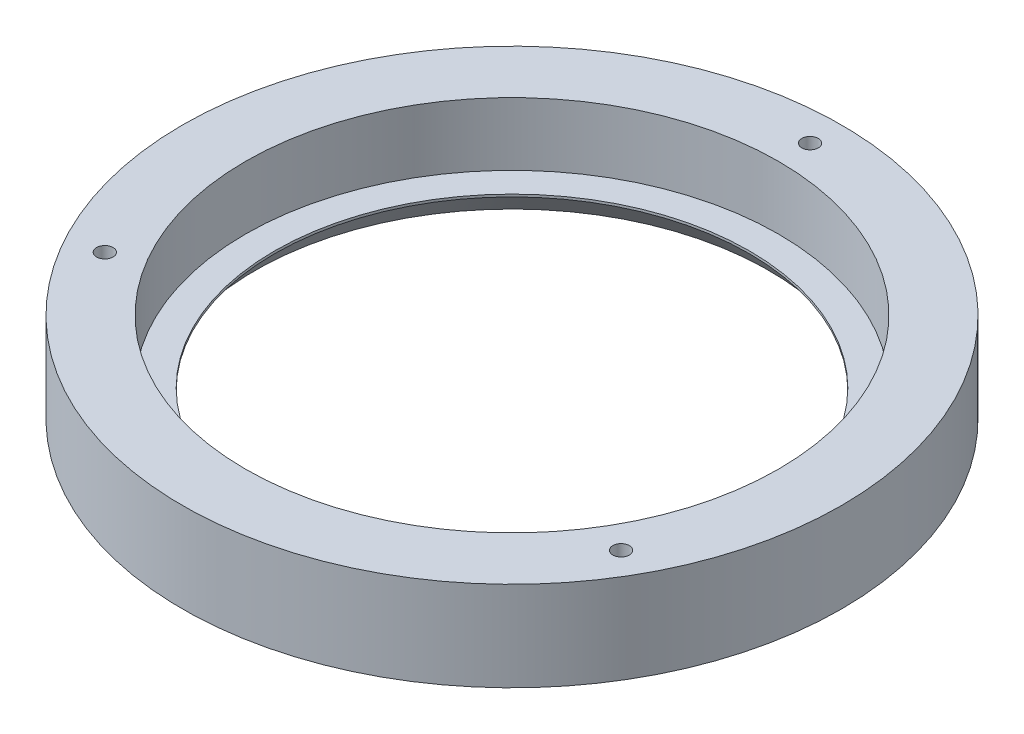
ISO-10303-21;
HEADER;
FILE_DESCRIPTION(('STEP AP214'),'2;1');
FILE_NAME('part.step','',(''),(''),'','','');
FILE_SCHEMA(('AUTOMOTIVE_DESIGN { 1 0 10303 214 1 1 1 1 }'));
ENDSEC;
DATA;
#1=APPLICATION_CONTEXT('core data for automotive mechanical design processes');
#2=APPLICATION_PROTOCOL_DEFINITION('international standard','automotive_design',2000,#1);
#3=PRODUCT_CONTEXT('',#1,'mechanical');
#4=PRODUCT('Part','Part','',(#3));
#5=PRODUCT_RELATED_PRODUCT_CATEGORY('part','',(#4));
#6=PRODUCT_DEFINITION_FORMATION('','',#4);
#7=PRODUCT_DEFINITION_CONTEXT('part definition',#1,'design');
#8=PRODUCT_DEFINITION('design','',#6,#7);
#9=PRODUCT_DEFINITION_SHAPE('','',#8);
#10=(LENGTH_UNIT() NAMED_UNIT(*) SI_UNIT(.MILLI.,.METRE.));
#11=(NAMED_UNIT(*) PLANE_ANGLE_UNIT() SI_UNIT($,.RADIAN.));
#12=(NAMED_UNIT(*) SI_UNIT($,.STERADIAN.) SOLID_ANGLE_UNIT());
#13=UNCERTAINTY_MEASURE_WITH_UNIT(LENGTH_MEASURE(1.E-05),#10,'distance_accuracy_value','');
#14=(GEOMETRIC_REPRESENTATION_CONTEXT(3) GLOBAL_UNCERTAINTY_ASSIGNED_CONTEXT((#13)) GLOBAL_UNIT_ASSIGNED_CONTEXT((#10,
#11,#12)) REPRESENTATION_CONTEXT('',''));
#15=CARTESIAN_POINT('',(0.,0.,0.));
#16=DIRECTION('',(0.,0.,1.));
#17=DIRECTION('',(1.,0.,0.));
#18=AXIS2_PLACEMENT_3D('',#15,#16,#17);
#19=CARTESIAN_POINT('',(1.66533453693773E-13,-2.77555756156289E-13,-61.4999999999997));
#20=DIRECTION('',(0.,1.,0.));
#21=DIRECTION('',(-1.,0.,0.));
#22=AXIS2_PLACEMENT_3D('',#19,#20,#21);
#23=CYLINDRICAL_SURFACE('',#22,1.70000000000001);
#24=CARTESIAN_POINT('',(0.,18.4999999999999,-61.4999999999998));
#25=DIRECTION('',(0.,1.,0.));
#26=DIRECTION('',(-1.,0.,0.));
#27=AXIS2_PLACEMENT_3D('',#24,#25,#26);
#28=CIRCLE('',#27,1.70000000000001);
#29=CARTESIAN_POINT('',(-1.70000000000006,18.4999999999999,-61.4999999999998));
#30=VERTEX_POINT('',#29);
#31=EDGE_CURVE('E384',#30,#30,#28,.T.);
#32=ORIENTED_EDGE('',*,*,#31,.T.);
#33=EDGE_LOOP('',(#32));
#34=FACE_BOUND('',#33,.T.);
#35=CARTESIAN_POINT('',(0.,2.99999999999973,-61.5));
#36=DIRECTION('',(0.,-1.,0.));
#37=DIRECTION('',(1.,0.,0.));
#38=AXIS2_PLACEMENT_3D('',#35,#36,#37);
#39=CIRCLE('',#38,1.70000000000001);
#40=CARTESIAN_POINT('',(1.70000000000001,2.99999999999973,-61.5));
#41=VERTEX_POINT('',#40);
#42=EDGE_CURVE('E50',#41,#41,#39,.F.);
#43=ORIENTED_EDGE('',*,*,#42,.F.);
#44=EDGE_LOOP('',(#43));
#45=FACE_BOUND('',#44,.T.);
#46=ADVANCED_FACE('F46',(#34,#45),#23,.F.);
#47=CARTESIAN_POINT('',(53.2605623327429,-2.77555756156289E-13,30.7500000000004));
#48=DIRECTION('',(0.,1.,0.));
#49=DIRECTION('',(-1.,0.,0.));
#50=AXIS2_PLACEMENT_3D('',#47,#48,#49);
#51=CYLINDRICAL_SURFACE('',#50,1.70000000000001);
#52=CARTESIAN_POINT('',(53.260562332743,18.4999999999995,30.7500000000008));
#53=DIRECTION('',(0.,1.,0.));
#54=DIRECTION('',(0.500000000000005,0.,-0.866025403784438));
#55=AXIS2_PLACEMENT_3D('',#52,#53,#54);
#56=CIRCLE('',#55,1.70000000000001);
#57=CARTESIAN_POINT('',(54.110562332743,18.4999999999995,29.2777568135672));
#58=VERTEX_POINT('',#57);
#59=EDGE_CURVE('E380',#58,#58,#56,.T.);
#60=ORIENTED_EDGE('',*,*,#59,.T.);
#61=EDGE_LOOP('',(#60));
#62=FACE_BOUND('',#61,.T.);
#63=CARTESIAN_POINT('',(53.2605623327429,2.99999999999973,30.7500000000004));
#64=DIRECTION('',(0.,-1.,0.));
#65=DIRECTION('',(1.,0.,0.));
#66=AXIS2_PLACEMENT_3D('',#63,#64,#65);
#67=CIRCLE('',#66,1.70000000000001);
#68=CARTESIAN_POINT('',(54.9605623327429,2.99999999999973,30.7500000000004));
#69=VERTEX_POINT('',#68);
#70=EDGE_CURVE('E238',#69,#69,#67,.F.);
#71=ORIENTED_EDGE('',*,*,#70,.F.);
#72=EDGE_LOOP('',(#71));
#73=FACE_BOUND('',#72,.T.);
#74=ADVANCED_FACE('F428',(#62,#73),#51,.F.);
#75=CARTESIAN_POINT('',(-53.2605623327435,-3.33066907387547E-13,30.7499999999996));
#76=DIRECTION('',(0.,1.,0.));
#77=DIRECTION('',(-1.,0.,0.));
#78=AXIS2_PLACEMENT_3D('',#75,#76,#77);
#79=CYLINDRICAL_SURFACE('',#78,1.70000000000001);
#80=CARTESIAN_POINT('',(-53.2605623327433,18.4999999999997,30.7499999999997));
#81=DIRECTION('',(0.,1.,0.));
#82=DIRECTION('',(0.499999999999993,0.,0.866025403784445));
#83=AXIS2_PLACEMENT_3D('',#80,#81,#82);
#84=CIRCLE('',#83,1.70000000000001);
#85=CARTESIAN_POINT('',(-52.4105623327433,18.4999999999997,32.2222431864333));
#86=VERTEX_POINT('',#85);
#87=EDGE_CURVE('E385',#86,#86,#84,.T.);
#88=ORIENTED_EDGE('',*,*,#87,.T.);
#89=EDGE_LOOP('',(#88));
#90=FACE_BOUND('',#89,.T.);
#91=CARTESIAN_POINT('',(-53.2605623327436,3.,30.7499999999996));
#92=DIRECTION('',(0.,-1.,0.));
#93=DIRECTION('',(1.,0.,0.));
#94=AXIS2_PLACEMENT_3D('',#91,#92,#93);
#95=CIRCLE('',#94,1.70000000000001);
#96=CARTESIAN_POINT('',(-51.5605623327436,3.,30.7499999999996));
#97=VERTEX_POINT('',#96);
#98=EDGE_CURVE('E364',#97,#97,#95,.F.);
#99=ORIENTED_EDGE('',*,*,#98,.F.);
#100=EDGE_LOOP('',(#99));
#101=FACE_BOUND('',#100,.T.);
#102=ADVANCED_FACE('F434',(#90,#101),#79,.F.);
#103=CARTESIAN_POINT('',(0.,4.99999999999995,2.77555756156289E-13));
#104=DIRECTION('',(0.,-1.,0.));
#105=DIRECTION('',(1.,0.,0.));
#106=AXIS2_PLACEMENT_3D('',#103,#104,#105);
#107=CONICAL_SURFACE('',#106,49.,0.674740942223553);
#108=CARTESIAN_POINT('',(0.,0.,0.));
#109=DIRECTION('',(0.,-1.,0.));
#110=DIRECTION('',(1.,0.,0.));
#111=AXIS2_PLACEMENT_3D('',#108,#109,#110);
#112=CIRCLE('',#111,53.);
#113=CARTESIAN_POINT('',(53.0000000000001,0.,0.));
#114=VERTEX_POINT('',#113);
#115=EDGE_CURVE('E11',#114,#114,#112,.T.);
#116=ORIENTED_EDGE('',*,*,#115,.T.);
#117=EDGE_LOOP('',(#116));
#118=FACE_BOUND('',#117,.T.);
#119=CARTESIAN_POINT('',(0.,4.99999999999995,2.77555756156289E-13));
#120=DIRECTION('',(0.,-1.,0.));
#121=DIRECTION('',(1.,0.,0.));
#122=AXIS2_PLACEMENT_3D('',#119,#120,#121);
#123=CIRCLE('',#122,49.);
#124=CARTESIAN_POINT('',(49.0000000000001,4.99999999999996,2.90428366921572E-13));
#125=VERTEX_POINT('',#124);
#126=EDGE_CURVE('E392',#125,#125,#123,.T.);
#127=ORIENTED_EDGE('',*,*,#126,.F.);
#128=EDGE_LOOP('',(#127));
#129=FACE_BOUND('',#128,.T.);
#130=ADVANCED_FACE('F48',(#118,#129),#107,.F.);
#131=CARTESIAN_POINT('',(53.,-2.63677968348475E-13,3.88578058618805E-13));
#132=DIRECTION('',(0.,-1.,0.));
#133=DIRECTION('',(1.,0.,0.));
#134=AXIS2_PLACEMENT_3D('',#131,#132,#133);
#135=PLANE('',#134);
#136=DIRECTION('',(0.499999999999994,0.,0.866025403784444));
#137=VECTOR('',#136,1.);
#138=CARTESIAN_POINT('',(1.67500000000087,-2.63677968348475E-13,-64.4011851026779));
#139=LINE('',#138,#137);
#140=CARTESIAN_POINT('',(1.67500000000087,-2.63677968348475E-13,-64.4011851026779));
#141=VERTEX_POINT('',#140);
#142=CARTESIAN_POINT('',(3.35000000000107,0.,-61.4999999999999));
#143=VERTEX_POINT('',#142);
#144=EDGE_CURVE('E64',#141,#143,#139,.T.);
#145=ORIENTED_EDGE('',*,*,#144,.F.);
#146=DIRECTION('',(1.,0.,0.));
#147=VECTOR('',#146,1.);
#148=CARTESIAN_POINT('',(-1.67499999999915,0.,-64.4011851026778));
#149=LINE('',#148,#147);
#150=CARTESIAN_POINT('',(-1.67499999999915,0.,-64.4011851026778));
#151=VERTEX_POINT('',#150);
#152=EDGE_CURVE('E199',#151,#141,#149,.T.);
#153=ORIENTED_EDGE('',*,*,#152,.F.);
#154=DIRECTION('',(0.500000000000007,0.,-0.866025403784437));
#155=VECTOR('',#154,1.);
#156=CARTESIAN_POINT('',(-3.34999999999896,-2.77555756156289E-13,-61.5000000000001));
#157=LINE('',#156,#155);
#158=CARTESIAN_POINT('',(-3.34999999999896,-2.77555756156289E-13,-61.5000000000001));
#159=VERTEX_POINT('',#158);
#160=EDGE_CURVE('E204',#159,#151,#157,.T.);
#161=ORIENTED_EDGE('',*,*,#160,.F.);
#162=DIRECTION('',(-0.499999999999995,0.,-0.866025403784444));
#163=VECTOR('',#162,1.);
#164=CARTESIAN_POINT('',(-1.67499999999915,-2.77555756156289E-13,-58.5988148973225));
#165=LINE('',#164,#163);
#166=CARTESIAN_POINT('',(-1.67499999999915,-2.77555756156289E-13,-58.5988148973225));
#167=VERTEX_POINT('',#166);
#168=EDGE_CURVE('E228',#167,#159,#165,.T.);
#169=ORIENTED_EDGE('',*,*,#168,.F.);
#170=DIRECTION('',(-1.,0.,0.));
#171=VECTOR('',#170,1.);
#172=CARTESIAN_POINT('',(1.67500000000087,-2.77555756156289E-13,-58.5988148973221));
#173=LINE('',#172,#171);
#174=CARTESIAN_POINT('',(1.67500000000087,-2.77555756156289E-13,-58.5988148973221));
#175=VERTEX_POINT('',#174);
#176=EDGE_CURVE('E224',#175,#167,#173,.T.);
#177=ORIENTED_EDGE('',*,*,#176,.F.);
#178=DIRECTION('',(-0.500000000000009,0.,0.866025403784436));
#179=VECTOR('',#178,1.);
#180=CARTESIAN_POINT('',(3.35000000000107,0.,-61.4999999999999));
#181=LINE('',#180,#179);
#182=EDGE_CURVE('E220',#143,#175,#181,.T.);
#183=ORIENTED_EDGE('',*,*,#182,.F.);
#184=EDGE_LOOP('',(#145,#153,#161,#169,#177,#183));
#185=FACE_BOUND('',#184,.T.);
#186=DIRECTION('',(-1.,0.,0.));
#187=VECTOR('',#186,1.);
#188=CARTESIAN_POINT('',(54.9355623327425,-2.22044604925031E-13,33.6511851026789));
#189=LINE('',#188,#187);
#190=CARTESIAN_POINT('',(54.9355623327425,-2.22044604925031E-13,33.6511851026789));
#191=VERTEX_POINT('',#190);
#192=CARTESIAN_POINT('',(51.5855623327428,-2.08166817117217E-13,33.6511851026792));
#193=VERTEX_POINT('',#192);
#194=EDGE_CURVE('E72',#191,#193,#189,.T.);
#195=ORIENTED_EDGE('',*,*,#194,.F.);
#196=DIRECTION('',(-0.500000000000012,0.,0.866025403784434));
#197=VECTOR('',#196,1.);
#198=CARTESIAN_POINT('',(56.6105623327425,0.,30.7500000000013));
#199=LINE('',#198,#197);
#200=CARTESIAN_POINT('',(56.6105623327425,0.,30.7500000000013));
#201=VERTEX_POINT('',#200);
#202=EDGE_CURVE('E255',#201,#191,#199,.T.);
#203=ORIENTED_EDGE('',*,*,#202,.F.);
#204=DIRECTION('',(0.499999999999991,0.,0.866025403784446));
#205=VECTOR('',#204,1.);
#206=CARTESIAN_POINT('',(54.9355623327423,-2.63677968348475E-13,27.8488148973233));
#207=LINE('',#206,#205);
#208=CARTESIAN_POINT('',(54.9355623327423,-2.63677968348475E-13,27.8488148973233));
#209=VERTEX_POINT('',#208);
#210=EDGE_CURVE('E290',#209,#201,#207,.T.);
#211=ORIENTED_EDGE('',*,*,#210,.F.);
#212=DIRECTION('',(1.,0.,0.));
#213=VECTOR('',#212,1.);
#214=CARTESIAN_POINT('',(51.5855623327427,0.,27.8488148973233));
#215=LINE('',#214,#213);
#216=CARTESIAN_POINT('',(51.5855623327427,0.,27.8488148973233));
#217=VERTEX_POINT('',#216);
#218=EDGE_CURVE('E286',#217,#209,#215,.T.);
#219=ORIENTED_EDGE('',*,*,#218,.F.);
#220=DIRECTION('',(0.500000000000014,0.,-0.866025403784432));
#221=VECTOR('',#220,1.);
#222=CARTESIAN_POINT('',(49.9105623327424,-2.77555756156289E-13,30.7500000000009));
#223=LINE('',#222,#221);
#224=CARTESIAN_POINT('',(49.9105623327424,-2.77555756156289E-13,30.7500000000009));
#225=VERTEX_POINT('',#224);
#226=EDGE_CURVE('E282',#225,#217,#223,.T.);
#227=ORIENTED_EDGE('',*,*,#226,.F.);
#228=DIRECTION('',(-0.499999999999989,0.,-0.866025403784447));
#229=VECTOR('',#228,1.);
#230=CARTESIAN_POINT('',(51.5855623327428,-2.08166817117217E-13,33.6511851026792));
#231=LINE('',#230,#229);
#232=EDGE_CURVE('E278',#193,#225,#231,.T.);
#233=ORIENTED_EDGE('',*,*,#232,.F.);
#234=EDGE_LOOP('',(#195,#203,#211,#219,#227,#233));
#235=FACE_BOUND('',#234,.T.);
#236=DIRECTION('',(0.500000000000004,0.,-0.866025403784438));
#237=VECTOR('',#236,1.);
#238=CARTESIAN_POINT('',(-56.6105623327437,0.,30.7499999999998));
#239=LINE('',#238,#237);
#240=CARTESIAN_POINT('',(-56.6105623327437,0.,30.7499999999998));
#241=VERTEX_POINT('',#240);
#242=CARTESIAN_POINT('',(-54.9355623327432,-2.77555756156289E-13,27.8488148973219));
#243=VERTEX_POINT('',#242);
#244=EDGE_CURVE('E339',#241,#243,#239,.T.);
#245=ORIENTED_EDGE('',*,*,#244,.F.);
#246=DIRECTION('',(-0.499999999999998,0.,-0.866025403784442));
#247=VECTOR('',#246,1.);
#248=CARTESIAN_POINT('',(-54.9355623327432,-3.33066907387547E-13,33.6511851026777));
#249=LINE('',#248,#247);
#250=CARTESIAN_POINT('',(-54.9355623327432,-3.33066907387547E-13,33.6511851026777));
#251=VERTEX_POINT('',#250);
#252=EDGE_CURVE('E318',#251,#241,#249,.T.);
#253=ORIENTED_EDGE('',*,*,#252,.F.);
#254=DIRECTION('',(-1.,0.,0.));
#255=VECTOR('',#254,1.);
#256=CARTESIAN_POINT('',(-51.5855623327433,-2.91433543964104E-13,33.6511851026775));
#257=LINE('',#256,#255);
#258=CARTESIAN_POINT('',(-51.5855623327433,-2.91433543964104E-13,33.6511851026775));
#259=VERTEX_POINT('',#258);
#260=EDGE_CURVE('E354',#259,#251,#257,.T.);
#261=ORIENTED_EDGE('',*,*,#260,.F.);
#262=DIRECTION('',(-0.500000000000003,0.,0.866025403784439));
#263=VECTOR('',#262,1.);
#264=CARTESIAN_POINT('',(-49.9105623327434,-2.22044604925031E-13,30.7499999999996));
#265=LINE('',#264,#263);
#266=CARTESIAN_POINT('',(-49.9105623327434,-2.22044604925031E-13,30.7499999999996));
#267=VERTEX_POINT('',#266);
#268=EDGE_CURVE('E350',#267,#259,#265,.T.);
#269=ORIENTED_EDGE('',*,*,#268,.F.);
#270=DIRECTION('',(0.499999999999996,0.,0.866025403784443));
#271=VECTOR('',#270,1.);
#272=CARTESIAN_POINT('',(-51.5855623327433,-2.77555756156289E-13,27.8488148973217));
#273=LINE('',#272,#271);
#274=CARTESIAN_POINT('',(-51.5855623327433,-2.77555756156289E-13,27.8488148973217));
#275=VERTEX_POINT('',#274);
#276=EDGE_CURVE('E346',#275,#267,#273,.T.);
#277=ORIENTED_EDGE('',*,*,#276,.F.);
#278=DIRECTION('',(1.,0.,0.));
#279=VECTOR('',#278,1.);
#280=CARTESIAN_POINT('',(-54.9355623327432,-2.77555756156289E-13,27.8488148973219));
#281=LINE('',#280,#279);
#282=EDGE_CURVE('E342',#243,#275,#281,.T.);
#283=ORIENTED_EDGE('',*,*,#282,.F.);
#284=EDGE_LOOP('',(#245,#253,#261,#269,#277,#283));
#285=FACE_BOUND('',#284,.T.);
#286=CARTESIAN_POINT('',(0.,0.,0.));
#287=DIRECTION('',(0.,-1.,0.));
#288=DIRECTION('',(1.,0.,0.));
#289=AXIS2_PLACEMENT_3D('',#286,#287,#288);
#290=CIRCLE('',#289,68.);
#291=CARTESIAN_POINT('',(68.0000000000002,0.,0.));
#292=VERTEX_POINT('',#291);
#293=EDGE_CURVE('E56',#292,#292,#290,.T.);
#294=ORIENTED_EDGE('',*,*,#293,.T.);
#295=EDGE_LOOP('',(#294));
#296=FACE_BOUND('',#295,.T.);
#297=ORIENTED_EDGE('',*,*,#115,.F.);
#298=EDGE_LOOP('',(#297));
#299=FACE_BOUND('',#298,.T.);
#300=ADVANCED_FACE('F458',(#185,#235,#285,#296,#299),#135,.T.);
#301=CARTESIAN_POINT('',(0.,-18.5000000000003,-1.66533453693773E-13));
#302=DIRECTION('',(0.,-1.,0.));
#303=DIRECTION('',(1.,0.,0.));
#304=AXIS2_PLACEMENT_3D('',#301,#302,#303);
#305=CYLINDRICAL_SURFACE('',#304,68.);
#306=CARTESIAN_POINT('',(0.,18.4999999999997,0.));
#307=DIRECTION('',(0.,-1.,0.));
#308=DIRECTION('',(1.,0.,0.));
#309=AXIS2_PLACEMENT_3D('',#306,#307,#308);
#310=CIRCLE('',#309,68.);
#311=CARTESIAN_POINT('',(68.0000000000001,18.4999999999997,0.));
#312=VERTEX_POINT('',#311);
#313=EDGE_CURVE('E408',#312,#312,#310,.T.);
#314=ORIENTED_EDGE('',*,*,#313,.T.);
#315=EDGE_LOOP('',(#314));
#316=FACE_BOUND('',#315,.T.);
#317=ORIENTED_EDGE('',*,*,#293,.F.);
#318=EDGE_LOOP('',(#317));
#319=FACE_BOUND('',#318,.T.);
#320=ADVANCED_FACE('F455',(#316,#319),#305,.T.);
#321=CARTESIAN_POINT('',(68.0000000000003,18.4999999999997,2.22044604925031E-13));
#322=DIRECTION('',(0.,1.,0.));
#323=DIRECTION('',(-1.,0.,0.));
#324=AXIS2_PLACEMENT_3D('',#321,#322,#323);
#325=PLANE('',#324);
#326=ORIENTED_EDGE('',*,*,#59,.F.);
#327=EDGE_LOOP('',(#326));
#328=FACE_BOUND('',#327,.T.);
#329=ORIENTED_EDGE('',*,*,#87,.F.);
#330=EDGE_LOOP('',(#329));
#331=FACE_BOUND('',#330,.T.);
#332=ORIENTED_EDGE('',*,*,#31,.F.);
#333=EDGE_LOOP('',(#332));
#334=FACE_BOUND('',#333,.T.);
#335=CARTESIAN_POINT('',(0.,18.4999999999997,0.));
#336=DIRECTION('',(0.,-1.,0.));
#337=DIRECTION('',(1.,0.,0.));
#338=AXIS2_PLACEMENT_3D('',#335,#336,#337);
#339=CIRCLE('',#338,55.);
#340=CARTESIAN_POINT('',(55.0000000000001,18.4999999999997,0.));
#341=VERTEX_POINT('',#340);
#342=EDGE_CURVE('E404',#341,#341,#339,.T.);
#343=ORIENTED_EDGE('',*,*,#342,.T.);
#344=EDGE_LOOP('',(#343));
#345=FACE_BOUND('',#344,.T.);
#346=ORIENTED_EDGE('',*,*,#313,.F.);
#347=EDGE_LOOP('',(#346));
#348=FACE_BOUND('',#347,.T.);
#349=ADVANCED_FACE('F451',(#328,#331,#334,#345,#348),#325,.T.);
#350=CARTESIAN_POINT('',(0.,-18.5000000000003,-1.66533453693773E-13));
#351=DIRECTION('',(0.,-1.,0.));
#352=DIRECTION('',(1.,0.,0.));
#353=AXIS2_PLACEMENT_3D('',#350,#351,#352);
#354=CYLINDRICAL_SURFACE('',#353,55.);
#355=CARTESIAN_POINT('',(0.,5.49999999999995,0.));
#356=DIRECTION('',(0.,-1.,0.));
#357=DIRECTION('',(1.,0.,0.));
#358=AXIS2_PLACEMENT_3D('',#355,#356,#357);
#359=CIRCLE('',#358,55.);
#360=CARTESIAN_POINT('',(55.0000000000001,5.49999999999996,0.));
#361=VERTEX_POINT('',#360);
#362=EDGE_CURVE('E400',#361,#361,#359,.T.);
#363=ORIENTED_EDGE('',*,*,#362,.T.);
#364=EDGE_LOOP('',(#363));
#365=FACE_BOUND('',#364,.T.);
#366=ORIENTED_EDGE('',*,*,#342,.F.);
#367=EDGE_LOOP('',(#366));
#368=FACE_BOUND('',#367,.T.);
#369=ADVANCED_FACE('F447',(#365,#368),#354,.F.);
#370=CARTESIAN_POINT('',(55.,5.49999999999972,2.77555756156289E-13));
#371=DIRECTION('',(0.,1.,0.));
#372=DIRECTION('',(-1.,0.,0.));
#373=AXIS2_PLACEMENT_3D('',#370,#371,#372);
#374=PLANE('',#373);
#375=CARTESIAN_POINT('',(0.,5.49999999999995,0.));
#376=DIRECTION('',(0.,-1.,0.));
#377=DIRECTION('',(1.,0.,0.));
#378=AXIS2_PLACEMENT_3D('',#375,#376,#377);
#379=CIRCLE('',#378,49.);
#380=CARTESIAN_POINT('',(49.0000000000001,5.49999999999996,0.));
#381=VERTEX_POINT('',#380);
#382=EDGE_CURVE('E396',#381,#381,#379,.T.);
#383=ORIENTED_EDGE('',*,*,#382,.T.);
#384=EDGE_LOOP('',(#383));
#385=FACE_BOUND('',#384,.T.);
#386=ORIENTED_EDGE('',*,*,#362,.F.);
#387=EDGE_LOOP('',(#386));
#388=FACE_BOUND('',#387,.T.);
#389=ADVANCED_FACE('F443',(#385,#388),#374,.T.);
#390=CARTESIAN_POINT('',(0.,-18.5000000000003,-1.66533453693773E-13));
#391=DIRECTION('',(0.,-1.,0.));
#392=DIRECTION('',(1.,0.,0.));
#393=AXIS2_PLACEMENT_3D('',#390,#391,#392);
#394=CYLINDRICAL_SURFACE('',#393,49.);
#395=ORIENTED_EDGE('',*,*,#126,.T.);
#396=EDGE_LOOP('',(#395));
#397=FACE_BOUND('',#396,.T.);
#398=ORIENTED_EDGE('',*,*,#382,.F.);
#399=EDGE_LOOP('',(#398));
#400=FACE_BOUND('',#399,.T.);
#401=ADVANCED_FACE('F439',(#397,#400),#394,.F.);
#402=CARTESIAN_POINT('',(0.,2.99999999999995,2.77555756156289E-13));
#403=DIRECTION('',(0.,-1.,0.));
#404=DIRECTION('',(1.,0.,0.));
#405=AXIS2_PLACEMENT_3D('',#402,#403,#404);
#406=PLANE('',#405);
#407=DIRECTION('',(0.500000000000004,0.,-0.866025403784438));
#408=VECTOR('',#407,1.);
#409=CARTESIAN_POINT('',(-56.6105623327437,2.99999999999984,30.7499999999997));
#410=LINE('',#409,#408);
#411=CARTESIAN_POINT('',(-56.6105623327437,2.99999999999984,30.7499999999997));
#412=VERTEX_POINT('',#411);
#413=CARTESIAN_POINT('',(-54.9355623327436,2.99999999999973,27.8488148973219));
#414=VERTEX_POINT('',#413);
#415=EDGE_CURVE('E313',#412,#414,#410,.T.);
#416=ORIENTED_EDGE('',*,*,#415,.T.);
#417=DIRECTION('',(1.,0.,0.));
#418=VECTOR('',#417,1.);
#419=CARTESIAN_POINT('',(-54.9355623327436,2.99999999999973,27.8488148973219));
#420=LINE('',#419,#418);
#421=CARTESIAN_POINT('',(-51.5855623327433,2.99999999999973,27.8488148973217));
#422=VERTEX_POINT('',#421);
#423=EDGE_CURVE('E317',#414,#422,#420,.T.);
#424=ORIENTED_EDGE('',*,*,#423,.T.);
#425=DIRECTION('',(0.499999999999996,0.,0.866025403784443));
#426=VECTOR('',#425,1.);
#427=CARTESIAN_POINT('',(-51.5855623327433,2.99999999999973,27.8488148973217));
#428=LINE('',#427,#426);
#429=CARTESIAN_POINT('',(-49.9105623327433,2.99999999999973,30.7499999999995));
#430=VERTEX_POINT('',#429);
#431=EDGE_CURVE('E322',#422,#430,#428,.T.);
#432=ORIENTED_EDGE('',*,*,#431,.T.);
#433=DIRECTION('',(-0.500000000000003,0.,0.866025403784439));
#434=VECTOR('',#433,1.);
#435=CARTESIAN_POINT('',(-49.9105623327433,2.99999999999973,30.7499999999995));
#436=LINE('',#435,#434);
#437=CARTESIAN_POINT('',(-51.5855623327434,2.99999999999973,33.6511851026775));
#438=VERTEX_POINT('',#437);
#439=EDGE_CURVE('E326',#430,#438,#436,.T.);
#440=ORIENTED_EDGE('',*,*,#439,.T.);
#441=DIRECTION('',(-1.,0.,0.));
#442=VECTOR('',#441,1.);
#443=CARTESIAN_POINT('',(-51.5855623327434,2.99999999999973,33.6511851026775));
#444=LINE('',#443,#442);
#445=CARTESIAN_POINT('',(-54.9355623327433,2.99999999999968,33.6511851026776));
#446=VERTEX_POINT('',#445);
#447=EDGE_CURVE('E330',#438,#446,#444,.T.);
#448=ORIENTED_EDGE('',*,*,#447,.T.);
#449=DIRECTION('',(-0.499999999999998,0.,-0.866025403784442));
#450=VECTOR('',#449,1.);
#451=CARTESIAN_POINT('',(-54.9355623327433,2.99999999999968,33.6511851026776));
#452=LINE('',#451,#450);
#453=EDGE_CURVE('E334',#446,#412,#452,.T.);
#454=ORIENTED_EDGE('',*,*,#453,.T.);
#455=EDGE_LOOP('',(#416,#424,#432,#440,#448,#454));
#456=FACE_BOUND('',#455,.T.);
#457=ORIENTED_EDGE('',*,*,#98,.T.);
#458=EDGE_LOOP('',(#457));
#459=FACE_BOUND('',#458,.T.);
#460=ADVANCED_FACE('F442',(#456,#459),#406,.T.);
#461=CARTESIAN_POINT('',(-56.6105623327437,2.99999999999984,30.7499999999997));
#462=DIRECTION('',(-0.866025403784439,0.,-0.500000000000004));
#463=DIRECTION('',(-0.500000000000004,0.,0.866025403784439));
#464=AXIS2_PLACEMENT_3D('',#461,#462,#463);
#465=PLANE('',#464);
#466=ORIENTED_EDGE('',*,*,#244,.T.);
#467=DIRECTION('',(0.,-1.,0.));
#468=VECTOR('',#467,1.);
#469=CARTESIAN_POINT('',(-54.9355623327436,2.99999999999973,27.8488148973219));
#470=LINE('',#469,#468);
#471=EDGE_CURVE('E338',#414,#243,#470,.T.);
#472=ORIENTED_EDGE('',*,*,#471,.F.);
#473=ORIENTED_EDGE('',*,*,#415,.F.);
#474=DIRECTION('',(0.,-1.,0.));
#475=VECTOR('',#474,1.);
#476=CARTESIAN_POINT('',(-56.6105623327437,2.99999999999984,30.7499999999997));
#477=LINE('',#476,#475);
#478=EDGE_CURVE('E361',#412,#241,#477,.T.);
#479=ORIENTED_EDGE('',*,*,#478,.T.);
#480=EDGE_LOOP('',(#466,#472,#473,#479));
#481=FACE_BOUND('',#480,.T.);
#482=ADVANCED_FACE('F493',(#481),#465,.F.);
#483=CARTESIAN_POINT('',(-54.9355623327433,2.99999999999968,33.6511851026776));
#484=DIRECTION('',(-0.866025403784443,0.,0.499999999999998));
#485=DIRECTION('',(0.499999999999998,0.,0.866025403784442));
#486=AXIS2_PLACEMENT_3D('',#483,#484,#485);
#487=PLANE('',#486);
#488=ORIENTED_EDGE('',*,*,#252,.T.);
#489=ORIENTED_EDGE('',*,*,#478,.F.);
#490=ORIENTED_EDGE('',*,*,#453,.F.);
#491=DIRECTION('',(0.,-1.,0.));
#492=VECTOR('',#491,1.);
#493=CARTESIAN_POINT('',(-54.9355623327433,2.99999999999968,33.6511851026776));
#494=LINE('',#493,#492);
#495=EDGE_CURVE('E365',#446,#251,#494,.T.);
#496=ORIENTED_EDGE('',*,*,#495,.T.);
#497=EDGE_LOOP('',(#488,#489,#490,#496));
#498=FACE_BOUND('',#497,.T.);
#499=ADVANCED_FACE('F504',(#498),#487,.F.);
#500=CARTESIAN_POINT('',(-51.5855623327434,2.99999999999973,33.6511851026775));
#501=DIRECTION('',(0.,0.,1.));
#502=DIRECTION('',(1.,0.,0.));
#503=AXIS2_PLACEMENT_3D('',#500,#501,#502);
#504=PLANE('',#503);
#505=ORIENTED_EDGE('',*,*,#260,.T.);
#506=ORIENTED_EDGE('',*,*,#495,.F.);
#507=ORIENTED_EDGE('',*,*,#447,.F.);
#508=DIRECTION('',(0.,-1.,0.));
#509=VECTOR('',#508,1.);
#510=CARTESIAN_POINT('',(-51.5855623327434,2.99999999999973,33.6511851026775));
#511=LINE('',#510,#509);
#512=EDGE_CURVE('E368',#438,#259,#511,.T.);
#513=ORIENTED_EDGE('',*,*,#512,.T.);
#514=EDGE_LOOP('',(#505,#506,#507,#513));
#515=FACE_BOUND('',#514,.T.);
#516=ADVANCED_FACE('F506',(#515),#504,.F.);
#517=CARTESIAN_POINT('',(-49.9105623327433,2.99999999999973,30.7499999999995));
#518=DIRECTION('',(0.866025403784439,0.,0.500000000000003));
#519=DIRECTION('',(0.500000000000003,0.,-0.866025403784439));
#520=AXIS2_PLACEMENT_3D('',#517,#518,#519);
#521=PLANE('',#520);
#522=ORIENTED_EDGE('',*,*,#268,.T.);
#523=ORIENTED_EDGE('',*,*,#512,.F.);
#524=ORIENTED_EDGE('',*,*,#439,.F.);
#525=DIRECTION('',(0.,-1.,0.));
#526=VECTOR('',#525,1.);
#527=CARTESIAN_POINT('',(-49.9105623327433,2.99999999999973,30.7499999999995));
#528=LINE('',#527,#526);
#529=EDGE_CURVE('E371',#430,#267,#528,.T.);
#530=ORIENTED_EDGE('',*,*,#529,.T.);
#531=EDGE_LOOP('',(#522,#523,#524,#530));
#532=FACE_BOUND('',#531,.T.);
#533=ADVANCED_FACE('F509',(#532),#521,.F.);
#534=CARTESIAN_POINT('',(-51.5855623327433,2.99999999999973,27.8488148973217));
#535=DIRECTION('',(0.866025403784444,0.,-0.499999999999996));
#536=DIRECTION('',(-0.499999999999996,0.,-0.866025403784443));
#537=AXIS2_PLACEMENT_3D('',#534,#535,#536);
#538=PLANE('',#537);
#539=ORIENTED_EDGE('',*,*,#276,.T.);
#540=ORIENTED_EDGE('',*,*,#529,.F.);
#541=ORIENTED_EDGE('',*,*,#431,.F.);
#542=DIRECTION('',(0.,-1.,0.));
#543=VECTOR('',#542,1.);
#544=CARTESIAN_POINT('',(-51.5855623327433,2.99999999999973,27.8488148973217));
#545=LINE('',#544,#543);
#546=EDGE_CURVE('E374',#422,#275,#545,.T.);
#547=ORIENTED_EDGE('',*,*,#546,.T.);
#548=EDGE_LOOP('',(#539,#540,#541,#547));
#549=FACE_BOUND('',#548,.T.);
#550=ADVANCED_FACE('F512',(#549),#538,.F.);
#551=CARTESIAN_POINT('',(-54.9355623327436,2.99999999999973,27.8488148973219));
#552=DIRECTION('',(0.,0.,-1.));
#553=DIRECTION('',(-1.,0.,0.));
#554=AXIS2_PLACEMENT_3D('',#551,#552,#553);
#555=PLANE('',#554);
#556=ORIENTED_EDGE('',*,*,#282,.T.);
#557=ORIENTED_EDGE('',*,*,#546,.F.);
#558=ORIENTED_EDGE('',*,*,#423,.F.);
#559=ORIENTED_EDGE('',*,*,#471,.T.);
#560=EDGE_LOOP('',(#556,#557,#558,#559));
#561=FACE_BOUND('',#560,.T.);
#562=ADVANCED_FACE('F497',(#561),#555,.F.);
#563=CARTESIAN_POINT('',(0.,2.99999999999995,2.77555756156289E-13));
#564=DIRECTION('',(0.,-1.,0.));
#565=DIRECTION('',(-0.499999999999993,0.,-0.866025403784445));
#566=AXIS2_PLACEMENT_3D('',#563,#564,#565);
#567=PLANE('',#566);
#568=DIRECTION('',(-1.,0.,0.));
#569=VECTOR('',#568,1.);
#570=CARTESIAN_POINT('',(54.9355623327426,2.99999999999971,33.6511851026791));
#571=LINE('',#570,#569);
#572=CARTESIAN_POINT('',(54.9355623327426,2.99999999999971,33.6511851026791));
#573=VERTEX_POINT('',#572);
#574=CARTESIAN_POINT('',(51.5855623327422,2.99999999999974,33.6511851026793));
#575=VERTEX_POINT('',#574);
#576=EDGE_CURVE('E250',#573,#575,#571,.T.);
#577=ORIENTED_EDGE('',*,*,#576,.T.);
#578=DIRECTION('',(-0.499999999999989,0.,-0.866025403784447));
#579=VECTOR('',#578,1.);
#580=CARTESIAN_POINT('',(51.5855623327422,2.99999999999974,33.6511851026793));
#581=LINE('',#580,#579);
#582=CARTESIAN_POINT('',(49.9105623327424,3.,30.7500000000009));
#583=VERTEX_POINT('',#582);
#584=EDGE_CURVE('E254',#575,#583,#581,.T.);
#585=ORIENTED_EDGE('',*,*,#584,.T.);
#586=DIRECTION('',(0.500000000000014,0.,-0.866025403784432));
#587=VECTOR('',#586,1.);
#588=CARTESIAN_POINT('',(49.9105623327424,3.,30.7500000000009));
#589=LINE('',#588,#587);
#590=CARTESIAN_POINT('',(51.5855623327422,2.99999999999978,27.8488148973234));
#591=VERTEX_POINT('',#590);
#592=EDGE_CURVE('E259',#583,#591,#589,.T.);
#593=ORIENTED_EDGE('',*,*,#592,.T.);
#594=DIRECTION('',(1.,0.,0.));
#595=VECTOR('',#594,1.);
#596=CARTESIAN_POINT('',(51.5855623327422,2.99999999999978,27.8488148973234));
#597=LINE('',#596,#595);
#598=CARTESIAN_POINT('',(54.9355623327425,3.00000000000002,27.8488148973234));
#599=VERTEX_POINT('',#598);
#600=EDGE_CURVE('E263',#591,#599,#597,.T.);
#601=ORIENTED_EDGE('',*,*,#600,.T.);
#602=DIRECTION('',(0.499999999999991,0.,0.866025403784446));
#603=VECTOR('',#602,1.);
#604=CARTESIAN_POINT('',(54.9355623327425,3.00000000000002,27.8488148973234));
#605=LINE('',#604,#603);
#606=CARTESIAN_POINT('',(56.6105623327427,3.00000000000002,30.7500000000014));
#607=VERTEX_POINT('',#606);
#608=EDGE_CURVE('E267',#599,#607,#605,.T.);
#609=ORIENTED_EDGE('',*,*,#608,.T.);
#610=DIRECTION('',(-0.500000000000012,0.,0.866025403784434));
#611=VECTOR('',#610,1.);
#612=CARTESIAN_POINT('',(56.6105623327427,3.00000000000002,30.7500000000014));
#613=LINE('',#612,#611);
#614=EDGE_CURVE('E271',#607,#573,#613,.T.);
#615=ORIENTED_EDGE('',*,*,#614,.T.);
#616=EDGE_LOOP('',(#577,#585,#593,#601,#609,#615));
#617=FACE_BOUND('',#616,.T.);
#618=ORIENTED_EDGE('',*,*,#70,.T.);
#619=EDGE_LOOP('',(#618));
#620=FACE_BOUND('',#619,.T.);
#621=ADVANCED_FACE('F519',(#617,#620),#567,.T.);
#622=CARTESIAN_POINT('',(54.9355623327426,2.99999999999971,33.6511851026791));
#623=DIRECTION('',(0.,0.,1.));
#624=DIRECTION('',(1.,0.,0.));
#625=AXIS2_PLACEMENT_3D('',#622,#623,#624);
#626=PLANE('',#625);
#627=ORIENTED_EDGE('',*,*,#194,.T.);
#628=DIRECTION('',(0.,-1.,0.));
#629=VECTOR('',#628,1.);
#630=CARTESIAN_POINT('',(51.5855623327422,2.99999999999974,33.6511851026793));
#631=LINE('',#630,#629);
#632=EDGE_CURVE('E275',#575,#193,#631,.T.);
#633=ORIENTED_EDGE('',*,*,#632,.F.);
#634=ORIENTED_EDGE('',*,*,#576,.F.);
#635=DIRECTION('',(0.,-1.,0.));
#636=VECTOR('',#635,1.);
#637=CARTESIAN_POINT('',(54.9355623327426,2.99999999999971,33.6511851026791));
#638=LINE('',#637,#636);
#639=EDGE_CURVE('E221',#573,#191,#638,.T.);
#640=ORIENTED_EDGE('',*,*,#639,.T.);
#641=EDGE_LOOP('',(#627,#633,#634,#640));
#642=FACE_BOUND('',#641,.T.);
#643=ADVANCED_FACE('F534',(#642),#626,.F.);
#644=CARTESIAN_POINT('',(56.6105623327427,3.00000000000002,30.7500000000014));
#645=DIRECTION('',(0.866025403784434,0.,0.500000000000013));
#646=DIRECTION('',(0.500000000000013,0.,-0.866025403784434));
#647=AXIS2_PLACEMENT_3D('',#644,#645,#646);
#648=PLANE('',#647);
#649=ORIENTED_EDGE('',*,*,#202,.T.);
#650=ORIENTED_EDGE('',*,*,#639,.F.);
#651=ORIENTED_EDGE('',*,*,#614,.F.);
#652=DIRECTION('',(0.,-1.,0.));
#653=VECTOR('',#652,1.);
#654=CARTESIAN_POINT('',(56.6105623327427,3.00000000000002,30.7500000000014));
#655=LINE('',#654,#653);
#656=EDGE_CURVE('E299',#607,#201,#655,.T.);
#657=ORIENTED_EDGE('',*,*,#656,.T.);
#658=EDGE_LOOP('',(#649,#650,#651,#657));
#659=FACE_BOUND('',#658,.T.);
#660=ADVANCED_FACE('F575',(#659),#648,.F.);
#661=CARTESIAN_POINT('',(54.9355623327425,3.00000000000002,27.8488148973234));
#662=DIRECTION('',(0.866025403784447,0.,-0.499999999999991));
#663=DIRECTION('',(-0.499999999999991,0.,-0.866025403784446));
#664=AXIS2_PLACEMENT_3D('',#661,#662,#663);
#665=PLANE('',#664);
#666=ORIENTED_EDGE('',*,*,#210,.T.);
#667=ORIENTED_EDGE('',*,*,#656,.F.);
#668=ORIENTED_EDGE('',*,*,#608,.F.);
#669=DIRECTION('',(0.,-1.,0.));
#670=VECTOR('',#669,1.);
#671=CARTESIAN_POINT('',(54.9355623327425,3.00000000000002,27.8488148973234));
#672=LINE('',#671,#670);
#673=EDGE_CURVE('E302',#599,#209,#672,.T.);
#674=ORIENTED_EDGE('',*,*,#673,.T.);
#675=EDGE_LOOP('',(#666,#667,#668,#674));
#676=FACE_BOUND('',#675,.T.);
#677=ADVANCED_FACE('F583',(#676),#665,.F.);
#678=CARTESIAN_POINT('',(51.5855623327422,2.99999999999978,27.8488148973234));
#679=DIRECTION('',(0.,0.,-1.));
#680=DIRECTION('',(-1.,0.,0.));
#681=AXIS2_PLACEMENT_3D('',#678,#679,#680);
#682=PLANE('',#681);
#683=ORIENTED_EDGE('',*,*,#218,.T.);
#684=ORIENTED_EDGE('',*,*,#673,.F.);
#685=ORIENTED_EDGE('',*,*,#600,.F.);
#686=DIRECTION('',(0.,-1.,0.));
#687=VECTOR('',#686,1.);
#688=CARTESIAN_POINT('',(51.5855623327422,2.99999999999978,27.8488148973234));
#689=LINE('',#688,#687);
#690=EDGE_CURVE('E305',#591,#217,#689,.T.);
#691=ORIENTED_EDGE('',*,*,#690,.T.);
#692=EDGE_LOOP('',(#683,#684,#685,#691));
#693=FACE_BOUND('',#692,.T.);
#694=ADVANCED_FACE('F593',(#693),#682,.F.);
#695=CARTESIAN_POINT('',(49.9105623327424,3.,30.7500000000009));
#696=DIRECTION('',(-0.866025403784433,0.,-0.500000000000014));
#697=DIRECTION('',(-0.500000000000014,0.,0.866025403784433));
#698=AXIS2_PLACEMENT_3D('',#695,#696,#697);
#699=PLANE('',#698);
#700=ORIENTED_EDGE('',*,*,#226,.T.);
#701=ORIENTED_EDGE('',*,*,#690,.F.);
#702=ORIENTED_EDGE('',*,*,#592,.F.);
#703=DIRECTION('',(0.,-1.,0.));
#704=VECTOR('',#703,1.);
#705=CARTESIAN_POINT('',(49.9105623327424,3.,30.7500000000009));
#706=LINE('',#705,#704);
#707=EDGE_CURVE('E308',#583,#225,#706,.T.);
#708=ORIENTED_EDGE('',*,*,#707,.T.);
#709=EDGE_LOOP('',(#700,#701,#702,#708));
#710=FACE_BOUND('',#709,.T.);
#711=ADVANCED_FACE('F603',(#710),#699,.F.);
#712=CARTESIAN_POINT('',(51.5855623327422,2.99999999999974,33.6511851026793));
#713=DIRECTION('',(-0.866025403784448,0.,0.499999999999989));
#714=DIRECTION('',(0.499999999999989,0.,0.866025403784447));
#715=AXIS2_PLACEMENT_3D('',#712,#713,#714);
#716=PLANE('',#715);
#717=ORIENTED_EDGE('',*,*,#232,.T.);
#718=ORIENTED_EDGE('',*,*,#707,.F.);
#719=ORIENTED_EDGE('',*,*,#584,.F.);
#720=ORIENTED_EDGE('',*,*,#632,.T.);
#721=EDGE_LOOP('',(#717,#718,#719,#720));
#722=FACE_BOUND('',#721,.T.);
#723=ADVANCED_FACE('F613',(#722),#716,.F.);
#724=CARTESIAN_POINT('',(0.,2.99999999999995,2.77555756156289E-13));
#725=DIRECTION('',(0.,-1.,0.));
#726=DIRECTION('',(-0.500000000000005,0.,0.866025403784438));
#727=AXIS2_PLACEMENT_3D('',#724,#725,#726);
#728=PLANE('',#727);
#729=DIRECTION('',(0.499999999999994,0.,0.866025403784444));
#730=VECTOR('',#729,1.);
#731=CARTESIAN_POINT('',(1.6750000000009,3.,-64.4011851026779));
#732=LINE('',#731,#730);
#733=CARTESIAN_POINT('',(1.6750000000009,3.,-64.4011851026779));
#734=VERTEX_POINT('',#733);
#735=CARTESIAN_POINT('',(3.3500000000008,2.99999999999973,-61.4999999999998));
#736=VERTEX_POINT('',#735);
#737=EDGE_CURVE('E176',#734,#736,#732,.T.);
#738=ORIENTED_EDGE('',*,*,#737,.T.);
#739=DIRECTION('',(-0.500000000000009,0.,0.866025403784436));
#740=VECTOR('',#739,1.);
#741=CARTESIAN_POINT('',(3.3500000000008,2.99999999999973,-61.4999999999998));
#742=LINE('',#741,#740);
#743=CARTESIAN_POINT('',(1.67500000000087,2.99999999999995,-58.5988148973222));
#744=VERTEX_POINT('',#743);
#745=EDGE_CURVE('E186',#736,#744,#742,.T.);
#746=ORIENTED_EDGE('',*,*,#745,.T.);
#747=DIRECTION('',(-1.,0.,0.));
#748=VECTOR('',#747,1.);
#749=CARTESIAN_POINT('',(1.67500000000087,2.99999999999995,-58.5988148973222));
#750=LINE('',#749,#748);
#751=CARTESIAN_POINT('',(-1.67499999999918,2.99999999999974,-58.5988148973222));
#752=VERTEX_POINT('',#751);
#753=EDGE_CURVE('E192',#744,#752,#750,.T.);
#754=ORIENTED_EDGE('',*,*,#753,.T.);
#755=DIRECTION('',(-0.499999999999995,0.,-0.866025403784444));
#756=VECTOR('',#755,1.);
#757=CARTESIAN_POINT('',(-1.67499999999918,2.99999999999974,-58.5988148973222));
#758=LINE('',#757,#756);
#759=CARTESIAN_POINT('',(-3.34999999999921,2.99999999999974,-61.5));
#760=VERTEX_POINT('',#759);
#761=EDGE_CURVE('E209',#752,#760,#758,.T.);
#762=ORIENTED_EDGE('',*,*,#761,.T.);
#763=DIRECTION('',(0.500000000000007,0.,-0.866025403784437));
#764=VECTOR('',#763,1.);
#765=CARTESIAN_POINT('',(-3.34999999999921,2.99999999999974,-61.5));
#766=LINE('',#765,#764);
#767=CARTESIAN_POINT('',(-1.67499999999904,3.,-64.4011851026777));
#768=VERTEX_POINT('',#767);
#769=EDGE_CURVE('E213',#760,#768,#766,.T.);
#770=ORIENTED_EDGE('',*,*,#769,.T.);
#771=DIRECTION('',(1.,0.,0.));
#772=VECTOR('',#771,1.);
#773=CARTESIAN_POINT('',(-1.67499999999904,3.,-64.4011851026777));
#774=LINE('',#773,#772);
#775=EDGE_CURVE('E183',#768,#734,#774,.T.);
#776=ORIENTED_EDGE('',*,*,#775,.T.);
#777=EDGE_LOOP('',(#738,#746,#754,#762,#770,#776));
#778=FACE_BOUND('',#777,.T.);
#779=ORIENTED_EDGE('',*,*,#42,.T.);
#780=EDGE_LOOP('',(#779));
#781=FACE_BOUND('',#780,.T.);
#782=ADVANCED_FACE('F194',(#778,#781),#728,.T.);
#783=CARTESIAN_POINT('',(1.6750000000009,3.,-64.4011851026779));
#784=DIRECTION('',(0.866025403784445,0.,-0.499999999999994));
#785=DIRECTION('',(-0.499999999999994,0.,-0.866025403784444));
#786=AXIS2_PLACEMENT_3D('',#783,#784,#785);
#787=PLANE('',#786);
#788=ORIENTED_EDGE('',*,*,#144,.T.);
#789=DIRECTION('',(0.,-1.,0.));
#790=VECTOR('',#789,1.);
#791=CARTESIAN_POINT('',(3.3500000000008,2.99999999999973,-61.4999999999998));
#792=LINE('',#791,#790);
#793=EDGE_CURVE('E172',#736,#143,#792,.T.);
#794=ORIENTED_EDGE('',*,*,#793,.F.);
#795=ORIENTED_EDGE('',*,*,#737,.F.);
#796=DIRECTION('',(0.,-1.,0.));
#797=VECTOR('',#796,1.);
#798=CARTESIAN_POINT('',(1.6750000000009,3.,-64.4011851026779));
#799=LINE('',#798,#797);
#800=EDGE_CURVE('E235',#734,#141,#799,.T.);
#801=ORIENTED_EDGE('',*,*,#800,.T.);
#802=EDGE_LOOP('',(#788,#794,#795,#801));
#803=FACE_BOUND('',#802,.T.);
#804=ADVANCED_FACE('F174',(#803),#787,.F.);
#805=CARTESIAN_POINT('',(-1.67499999999904,3.,-64.4011851026777));
#806=DIRECTION('',(0.,0.,-1.));
#807=DIRECTION('',(-1.,0.,0.));
#808=AXIS2_PLACEMENT_3D('',#805,#806,#807);
#809=PLANE('',#808);
#810=ORIENTED_EDGE('',*,*,#152,.T.);
#811=ORIENTED_EDGE('',*,*,#800,.F.);
#812=ORIENTED_EDGE('',*,*,#775,.F.);
#813=DIRECTION('',(0.,-1.,0.));
#814=VECTOR('',#813,1.);
#815=CARTESIAN_POINT('',(-1.67499999999904,3.,-64.4011851026777));
#816=LINE('',#815,#814);
#817=EDGE_CURVE('E239',#768,#151,#816,.T.);
#818=ORIENTED_EDGE('',*,*,#817,.T.);
#819=EDGE_LOOP('',(#810,#811,#812,#818));
#820=FACE_BOUND('',#819,.T.);
#821=ADVANCED_FACE('F639',(#820),#809,.F.);
#822=CARTESIAN_POINT('',(-3.34999999999921,2.99999999999974,-61.5));
#823=DIRECTION('',(-0.866025403784437,0.,-0.500000000000007));
#824=DIRECTION('',(-0.500000000000007,0.,0.866025403784437));
#825=AXIS2_PLACEMENT_3D('',#822,#823,#824);
#826=PLANE('',#825);
#827=ORIENTED_EDGE('',*,*,#160,.T.);
#828=ORIENTED_EDGE('',*,*,#817,.F.);
#829=ORIENTED_EDGE('',*,*,#769,.F.);
#830=DIRECTION('',(0.,-1.,0.));
#831=VECTOR('',#830,1.);
#832=CARTESIAN_POINT('',(-3.34999999999921,2.99999999999974,-61.5));
#833=LINE('',#832,#831);
#834=EDGE_CURVE('E242',#760,#159,#833,.T.);
#835=ORIENTED_EDGE('',*,*,#834,.T.);
#836=EDGE_LOOP('',(#827,#828,#829,#835));
#837=FACE_BOUND('',#836,.T.);
#838=ADVANCED_FACE('F648',(#837),#826,.F.);
#839=CARTESIAN_POINT('',(-1.67499999999918,2.99999999999974,-58.5988148973222));
#840=DIRECTION('',(-0.866025403784444,0.,0.499999999999995));
#841=DIRECTION('',(0.499999999999995,0.,0.866025403784444));
#842=AXIS2_PLACEMENT_3D('',#839,#840,#841);
#843=PLANE('',#842);
#844=ORIENTED_EDGE('',*,*,#168,.T.);
#845=ORIENTED_EDGE('',*,*,#834,.F.);
#846=ORIENTED_EDGE('',*,*,#761,.F.);
#847=DIRECTION('',(0.,-1.,0.));
#848=VECTOR('',#847,1.);
#849=CARTESIAN_POINT('',(-1.67499999999918,2.99999999999974,-58.5988148973222));
#850=LINE('',#849,#848);
#851=EDGE_CURVE('E245',#752,#167,#850,.T.);
#852=ORIENTED_EDGE('',*,*,#851,.T.);
#853=EDGE_LOOP('',(#844,#845,#846,#852));
#854=FACE_BOUND('',#853,.T.);
#855=ADVANCED_FACE('F658',(#854),#843,.F.);
#856=CARTESIAN_POINT('',(1.67500000000087,2.99999999999995,-58.5988148973222));
#857=DIRECTION('',(0.,0.,1.));
#858=DIRECTION('',(1.,0.,0.));
#859=AXIS2_PLACEMENT_3D('',#856,#857,#858);
#860=PLANE('',#859);
#861=ORIENTED_EDGE('',*,*,#176,.T.);
#862=ORIENTED_EDGE('',*,*,#851,.F.);
#863=ORIENTED_EDGE('',*,*,#753,.F.);
#864=DIRECTION('',(0.,-1.,0.));
#865=VECTOR('',#864,1.);
#866=CARTESIAN_POINT('',(1.67500000000087,2.99999999999995,-58.5988148973222));
#867=LINE('',#866,#865);
#868=EDGE_CURVE('E182',#744,#175,#867,.T.);
#869=ORIENTED_EDGE('',*,*,#868,.T.);
#870=EDGE_LOOP('',(#861,#862,#863,#869));
#871=FACE_BOUND('',#870,.T.);
#872=ADVANCED_FACE('F668',(#871),#860,.F.);
#873=CARTESIAN_POINT('',(3.3500000000008,2.99999999999973,-61.4999999999998));
#874=DIRECTION('',(0.866025403784436,0.,0.500000000000009));
#875=DIRECTION('',(0.500000000000009,0.,-0.866025403784436));
#876=AXIS2_PLACEMENT_3D('',#873,#874,#875);
#877=PLANE('',#876);
#878=ORIENTED_EDGE('',*,*,#182,.T.);
#879=ORIENTED_EDGE('',*,*,#868,.F.);
#880=ORIENTED_EDGE('',*,*,#745,.F.);
#881=ORIENTED_EDGE('',*,*,#793,.T.);
#882=EDGE_LOOP('',(#878,#879,#880,#881));
#883=FACE_BOUND('',#882,.T.);
#884=ADVANCED_FACE('F187',(#883),#877,.F.);
#885=CLOSED_SHELL('',(#46,#74,#102,#130,#300,#320,#349,#369,#389,#401,#460,#482,#499,#516,#533,
#550,#562,#621,#643,#660,#677,#694,#711,#723,#782,#804,#821,#838,#855,#872,#884));
#886=MANIFOLD_SOLID_BREP('B2',#885);
#887=ADVANCED_BREP_SHAPE_REPRESENTATION('',(#18,#886),#14);
#888=SHAPE_DEFINITION_REPRESENTATION(#9,#887);
ENDSEC;
END-ISO-10303-21;
